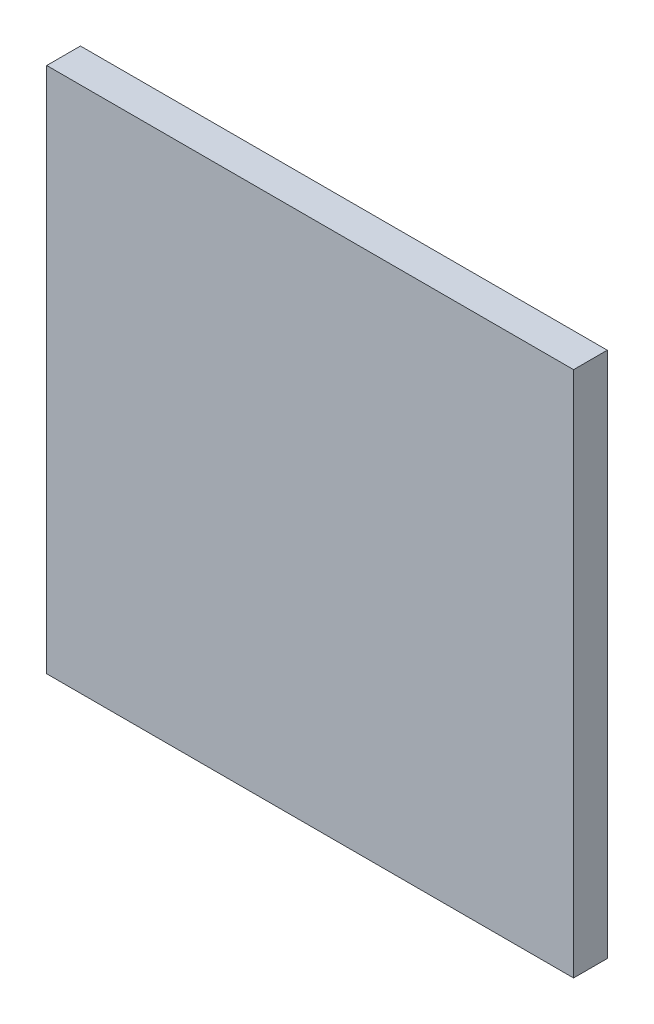
ISO-10303-21;
HEADER;
FILE_DESCRIPTION(('STEP AP214'),'2;1');
FILE_NAME('part.step','',(''),(''),'','','');
FILE_SCHEMA(('AUTOMOTIVE_DESIGN { 1 0 10303 214 1 1 1 1 }'));
ENDSEC;
DATA;
#1=APPLICATION_CONTEXT('core data for automotive mechanical design processes');
#2=APPLICATION_PROTOCOL_DEFINITION('international standard','automotive_design',2000,#1);
#3=PRODUCT_CONTEXT('',#1,'mechanical');
#4=PRODUCT('Part','Part','',(#3));
#5=PRODUCT_RELATED_PRODUCT_CATEGORY('part','',(#4));
#6=PRODUCT_DEFINITION_FORMATION('','',#4);
#7=PRODUCT_DEFINITION_CONTEXT('part definition',#1,'design');
#8=PRODUCT_DEFINITION('design','',#6,#7);
#9=PRODUCT_DEFINITION_SHAPE('','',#8);
#10=(LENGTH_UNIT() NAMED_UNIT(*) SI_UNIT(.MILLI.,.METRE.));
#11=(NAMED_UNIT(*) PLANE_ANGLE_UNIT() SI_UNIT($,.RADIAN.));
#12=(NAMED_UNIT(*) SI_UNIT($,.STERADIAN.) SOLID_ANGLE_UNIT());
#13=UNCERTAINTY_MEASURE_WITH_UNIT(LENGTH_MEASURE(1.E-05),#10,'distance_accuracy_value','');
#14=(GEOMETRIC_REPRESENTATION_CONTEXT(3) GLOBAL_UNCERTAINTY_ASSIGNED_CONTEXT((#13)) GLOBAL_UNIT_ASSIGNED_CONTEXT((#10,
#11,#12)) REPRESENTATION_CONTEXT('',''));
#15=CARTESIAN_POINT('',(0.,0.,0.));
#16=DIRECTION('',(0.,0.,1.));
#17=DIRECTION('',(1.,0.,0.));
#18=AXIS2_PLACEMENT_3D('',#15,#16,#17);
#19=CARTESIAN_POINT('',(0.,0.,0.800000000000004));
#20=DIRECTION('',(1.,0.,0.));
#21=DIRECTION('',(0.,0.,-1.));
#22=AXIS2_PLACEMENT_3D('',#19,#20,#21);
#23=PLANE('',#22);
#24=DIRECTION('',(0.,-1.,0.));
#25=VECTOR('',#24,1.);
#26=CARTESIAN_POINT('',(0.,0.,0.));
#27=LINE('',#26,#25);
#28=CARTESIAN_POINT('',(0.,12.5,0.));
#29=VERTEX_POINT('',#28);
#30=CARTESIAN_POINT('',(0.,0.,0.));
#31=VERTEX_POINT('',#30);
#32=EDGE_CURVE('E107',#29,#31,#27,.T.);
#33=ORIENTED_EDGE('',*,*,#32,.T.);
#34=DIRECTION('',(0.,0.,-1.));
#35=VECTOR('',#34,1.);
#36=CARTESIAN_POINT('',(0.,0.,0.800000000000004));
#37=LINE('',#36,#35);
#38=CARTESIAN_POINT('',(0.,0.,0.800000000000004));
#39=VERTEX_POINT('',#38);
#40=EDGE_CURVE('E11',#39,#31,#37,.T.);
#41=ORIENTED_EDGE('',*,*,#40,.F.);
#42=DIRECTION('',(0.,-1.,0.));
#43=VECTOR('',#42,1.);
#44=CARTESIAN_POINT('',(0.,0.,0.800000000000004));
#45=LINE('',#44,#43);
#46=CARTESIAN_POINT('',(0.,12.5,0.8));
#47=VERTEX_POINT('',#46);
#48=EDGE_CURVE('E90',#47,#39,#45,.T.);
#49=ORIENTED_EDGE('',*,*,#48,.F.);
#50=DIRECTION('',(0.,0.,-1.));
#51=VECTOR('',#50,1.);
#52=CARTESIAN_POINT('',(0.,12.5,0.8));
#53=LINE('',#52,#51);
#54=EDGE_CURVE('E103',#47,#29,#53,.T.);
#55=ORIENTED_EDGE('',*,*,#54,.T.);
#56=EDGE_LOOP('',(#33,#41,#49,#55));
#57=FACE_BOUND('',#56,.T.);
#58=ADVANCED_FACE('F38',(#57),#23,.F.);
#59=CARTESIAN_POINT('',(0.,0.,0.800000000000004));
#60=DIRECTION('',(0.,1.,0.));
#61=DIRECTION('',(0.,0.,1.));
#62=AXIS2_PLACEMENT_3D('',#59,#60,#61);
#63=PLANE('',#62);
#64=DIRECTION('',(1.,0.,0.));
#65=VECTOR('',#64,1.);
#66=CARTESIAN_POINT('',(0.,0.,0.));
#67=LINE('',#66,#65);
#68=CARTESIAN_POINT('',(12.5,0.,0.));
#69=VERTEX_POINT('',#68);
#70=EDGE_CURVE('E95',#31,#69,#67,.T.);
#71=ORIENTED_EDGE('',*,*,#70,.T.);
#72=DIRECTION('',(0.,0.,-1.));
#73=VECTOR('',#72,1.);
#74=CARTESIAN_POINT('',(12.5,0.,0.800000000000018));
#75=LINE('',#74,#73);
#76=CARTESIAN_POINT('',(12.5,0.,0.800000000000018));
#77=VERTEX_POINT('',#76);
#78=EDGE_CURVE('E47',#77,#69,#75,.T.);
#79=ORIENTED_EDGE('',*,*,#78,.F.);
#80=DIRECTION('',(1.,0.,0.));
#81=VECTOR('',#80,1.);
#82=CARTESIAN_POINT('',(0.,0.,0.800000000000004));
#83=LINE('',#82,#81);
#84=EDGE_CURVE('E85',#39,#77,#83,.T.);
#85=ORIENTED_EDGE('',*,*,#84,.F.);
#86=ORIENTED_EDGE('',*,*,#40,.T.);
#87=EDGE_LOOP('',(#71,#79,#85,#86));
#88=FACE_BOUND('',#87,.T.);
#89=ADVANCED_FACE('F94',(#88),#63,.F.);
#90=CARTESIAN_POINT('',(12.5,0.,0.800000000000018));
#91=DIRECTION('',(-1.,0.,0.));
#92=DIRECTION('',(0.,0.,1.));
#93=AXIS2_PLACEMENT_3D('',#90,#91,#92);
#94=PLANE('',#93);
#95=DIRECTION('',(0.,1.,0.));
#96=VECTOR('',#95,1.);
#97=CARTESIAN_POINT('',(12.5,0.,0.));
#98=LINE('',#97,#96);
#99=CARTESIAN_POINT('',(12.5,12.5,0.));
#100=VERTEX_POINT('',#99);
#101=EDGE_CURVE('E72',#69,#100,#98,.T.);
#102=ORIENTED_EDGE('',*,*,#101,.T.);
#103=DIRECTION('',(0.,0.,-1.));
#104=VECTOR('',#103,1.);
#105=CARTESIAN_POINT('',(12.5,12.5,0.8));
#106=LINE('',#105,#104);
#107=CARTESIAN_POINT('',(12.5,12.5,0.8));
#108=VERTEX_POINT('',#107);
#109=EDGE_CURVE('E97',#108,#100,#106,.T.);
#110=ORIENTED_EDGE('',*,*,#109,.F.);
#111=DIRECTION('',(0.,1.,0.));
#112=VECTOR('',#111,1.);
#113=CARTESIAN_POINT('',(12.5,0.,0.800000000000018));
#114=LINE('',#113,#112);
#115=EDGE_CURVE('E88',#77,#108,#114,.T.);
#116=ORIENTED_EDGE('',*,*,#115,.F.);
#117=ORIENTED_EDGE('',*,*,#78,.T.);
#118=EDGE_LOOP('',(#102,#110,#116,#117));
#119=FACE_BOUND('',#118,.T.);
#120=ADVANCED_FACE('F98',(#119),#94,.F.);
#121=CARTESIAN_POINT('',(0.,12.5,0.8));
#122=DIRECTION('',(0.,-1.,0.));
#123=DIRECTION('',(0.,0.,-1.));
#124=AXIS2_PLACEMENT_3D('',#121,#122,#123);
#125=PLANE('',#124);
#126=DIRECTION('',(-1.,0.,0.));
#127=VECTOR('',#126,1.);
#128=CARTESIAN_POINT('',(0.,12.5,0.));
#129=LINE('',#128,#127);
#130=EDGE_CURVE('E78',#100,#29,#129,.T.);
#131=ORIENTED_EDGE('',*,*,#130,.T.);
#132=ORIENTED_EDGE('',*,*,#54,.F.);
#133=DIRECTION('',(-1.,0.,0.));
#134=VECTOR('',#133,1.);
#135=CARTESIAN_POINT('',(0.,12.5,0.8));
#136=LINE('',#135,#134);
#137=EDGE_CURVE('E55',#108,#47,#136,.T.);
#138=ORIENTED_EDGE('',*,*,#137,.F.);
#139=ORIENTED_EDGE('',*,*,#109,.T.);
#140=EDGE_LOOP('',(#131,#132,#138,#139));
#141=FACE_BOUND('',#140,.T.);
#142=ADVANCED_FACE('F121',(#141),#125,.F.);
#143=CARTESIAN_POINT('',(0.,0.,0.800000000000004));
#144=DIRECTION('',(0.,0.,-1.));
#145=DIRECTION('',(-1.,0.,0.));
#146=AXIS2_PLACEMENT_3D('',#143,#144,#145);
#147=PLANE('',#146);
#148=ORIENTED_EDGE('',*,*,#48,.T.);
#149=ORIENTED_EDGE('',*,*,#84,.T.);
#150=ORIENTED_EDGE('',*,*,#115,.T.);
#151=ORIENTED_EDGE('',*,*,#137,.T.);
#152=EDGE_LOOP('',(#148,#149,#150,#151));
#153=FACE_BOUND('',#152,.T.);
#154=ADVANCED_FACE('F86',(#153),#147,.F.);
#155=CARTESIAN_POINT('',(0.,0.,0.));
#156=DIRECTION('',(0.,0.,-1.));
#157=DIRECTION('',(-1.,0.,0.));
#158=AXIS2_PLACEMENT_3D('',#155,#156,#157);
#159=PLANE('',#158);
#160=ORIENTED_EDGE('',*,*,#32,.F.);
#161=ORIENTED_EDGE('',*,*,#130,.F.);
#162=ORIENTED_EDGE('',*,*,#101,.F.);
#163=ORIENTED_EDGE('',*,*,#70,.F.);
#164=EDGE_LOOP('',(#160,#161,#162,#163));
#165=FACE_BOUND('',#164,.T.);
#166=ADVANCED_FACE('F124',(#165),#159,.T.);
#167=CLOSED_SHELL('',(#58,#89,#120,#142,#154,#166));
#168=MANIFOLD_SOLID_BREP('B2',#167);
#169=ADVANCED_BREP_SHAPE_REPRESENTATION('',(#18,#168),#14);
#170=SHAPE_DEFINITION_REPRESENTATION(#9,#169);
ENDSEC;
END-ISO-10303-21;
